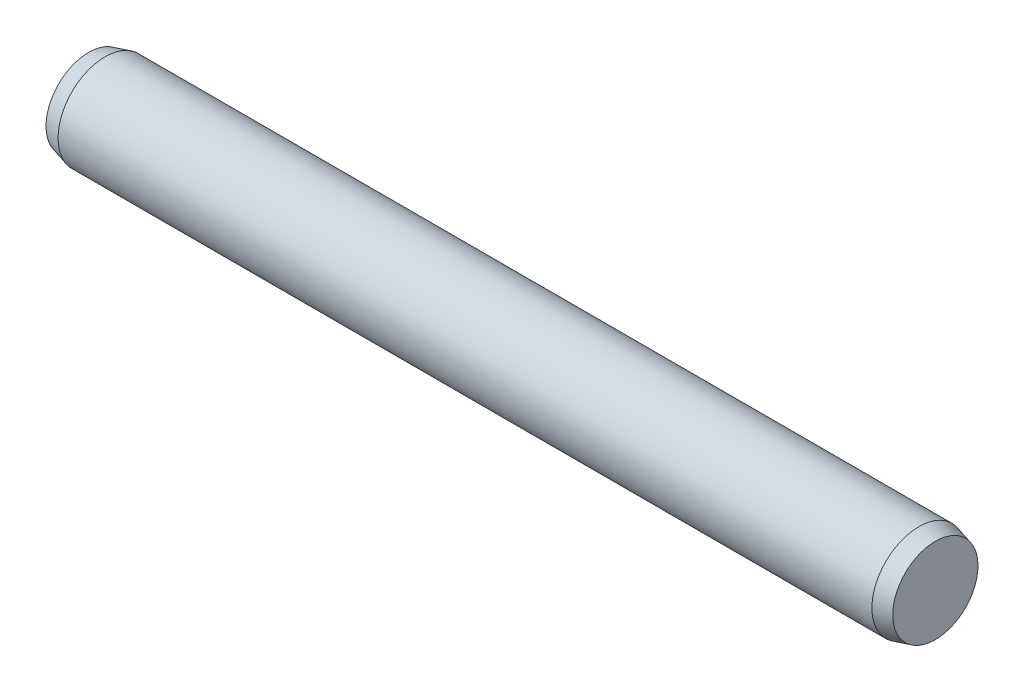
ISO-10303-21;
HEADER;
FILE_DESCRIPTION(('STEP AP214'),'2;1');
FILE_NAME('part.step','',(''),(''),'','','');
FILE_SCHEMA(('AUTOMOTIVE_DESIGN { 1 0 10303 214 1 1 1 1 }'));
ENDSEC;
DATA;
#1=APPLICATION_CONTEXT('core data for automotive mechanical design processes');
#2=APPLICATION_PROTOCOL_DEFINITION('international standard','automotive_design',2000,#1);
#3=PRODUCT_CONTEXT('',#1,'mechanical');
#4=PRODUCT('Part','Part','',(#3));
#5=PRODUCT_RELATED_PRODUCT_CATEGORY('part','',(#4));
#6=PRODUCT_DEFINITION_FORMATION('','',#4);
#7=PRODUCT_DEFINITION_CONTEXT('part definition',#1,'design');
#8=PRODUCT_DEFINITION('design','',#6,#7);
#9=PRODUCT_DEFINITION_SHAPE('','',#8);
#10=(LENGTH_UNIT() NAMED_UNIT(*) SI_UNIT(.MILLI.,.METRE.));
#11=(NAMED_UNIT(*) PLANE_ANGLE_UNIT() SI_UNIT($,.RADIAN.));
#12=(NAMED_UNIT(*) SI_UNIT($,.STERADIAN.) SOLID_ANGLE_UNIT());
#13=UNCERTAINTY_MEASURE_WITH_UNIT(LENGTH_MEASURE(1.E-05),#10,'distance_accuracy_value','');
#14=(GEOMETRIC_REPRESENTATION_CONTEXT(3) GLOBAL_UNCERTAINTY_ASSIGNED_CONTEXT((#13)) GLOBAL_UNIT_ASSIGNED_CONTEXT((#10,
#11,#12)) REPRESENTATION_CONTEXT('',''));
#15=CARTESIAN_POINT('',(0.,0.,0.));
#16=DIRECTION('',(0.,0.,1.));
#17=DIRECTION('',(1.,0.,0.));
#18=AXIS2_PLACEMENT_3D('',#15,#16,#17);
#19=CARTESIAN_POINT('',(-8.65,0.,0.));
#20=DIRECTION('',(1.,0.,0.));
#21=DIRECTION('',(0.,0.,-1.));
#22=AXIS2_PLACEMENT_3D('',#19,#20,#21);
#23=CYLINDRICAL_SURFACE('',#22,1.);
#24=CARTESIAN_POINT('',(-8.65,0.,0.));
#25=DIRECTION('',(-1.,0.,0.));
#26=DIRECTION('',(0.,0.,1.));
#27=AXIS2_PLACEMENT_3D('',#24,#25,#26);
#28=CIRCLE('',#27,1.);
#29=CARTESIAN_POINT('',(-8.65,0.,1.));
#30=VERTEX_POINT('',#29);
#31=EDGE_CURVE('E44',#30,#30,#28,.T.);
#32=ORIENTED_EDGE('',*,*,#31,.F.);
#33=EDGE_LOOP('',(#32));
#34=FACE_BOUND('',#33,.T.);
#35=CARTESIAN_POINT('',(8.65,0.,0.));
#36=DIRECTION('',(1.,0.,0.));
#37=DIRECTION('',(0.,0.,-1.));
#38=AXIS2_PLACEMENT_3D('',#35,#36,#37);
#39=CIRCLE('',#38,1.);
#40=CARTESIAN_POINT('',(8.65,0.,-1.));
#41=VERTEX_POINT('',#40);
#42=EDGE_CURVE('E10',#41,#41,#39,.T.);
#43=ORIENTED_EDGE('',*,*,#42,.F.);
#44=EDGE_LOOP('',(#43));
#45=FACE_BOUND('',#44,.T.);
#46=ADVANCED_FACE('F30',(#34,#45),#23,.T.);
#47=CARTESIAN_POINT('',(8.65,0.,0.));
#48=DIRECTION('',(-1.,0.,0.));
#49=DIRECTION('',(0.,0.,-1.));
#50=AXIS2_PLACEMENT_3D('',#47,#48,#49);
#51=CONICAL_SURFACE('',#50,1.,0.26179938779915);
#52=CARTESIAN_POINT('',(9.,0.,0.));
#53=DIRECTION('',(1.,0.,0.));
#54=DIRECTION('',(0.,0.,-1.));
#55=AXIS2_PLACEMENT_3D('',#52,#53,#54);
#56=CIRCLE('',#55,0.906217782649108);
#57=CARTESIAN_POINT('',(9.,0.,-0.906217782649108));
#58=VERTEX_POINT('',#57);
#59=EDGE_CURVE('E36',#58,#58,#56,.T.);
#60=ORIENTED_EDGE('',*,*,#59,.F.);
#61=EDGE_LOOP('',(#60));
#62=FACE_BOUND('',#61,.T.);
#63=ORIENTED_EDGE('',*,*,#42,.T.);
#64=EDGE_LOOP('',(#63));
#65=FACE_BOUND('',#64,.T.);
#66=ADVANCED_FACE('F54',(#62,#65),#51,.T.);
#67=CARTESIAN_POINT('',(9.,0.,0.));
#68=DIRECTION('',(1.,0.,0.));
#69=DIRECTION('',(0.,0.,-1.));
#70=AXIS2_PLACEMENT_3D('',#67,#68,#69);
#71=PLANE('',#70);
#72=ORIENTED_EDGE('',*,*,#59,.T.);
#73=EDGE_LOOP('',(#72));
#74=FACE_BOUND('',#73,.T.);
#75=ADVANCED_FACE('F58',(#74),#71,.T.);
#76=CARTESIAN_POINT('',(-8.65,0.,0.));
#77=DIRECTION('',(1.,0.,0.));
#78=DIRECTION('',(0.,0.,1.));
#79=AXIS2_PLACEMENT_3D('',#76,#77,#78);
#80=CONICAL_SURFACE('',#79,1.,0.26179938779915);
#81=CARTESIAN_POINT('',(-9.,0.,0.));
#82=DIRECTION('',(-1.,0.,0.));
#83=DIRECTION('',(0.,0.,1.));
#84=AXIS2_PLACEMENT_3D('',#81,#82,#83);
#85=CIRCLE('',#84,0.906217782649108);
#86=CARTESIAN_POINT('',(-9.,0.,0.906217782649108));
#87=VERTEX_POINT('',#86);
#88=EDGE_CURVE('E40',#87,#87,#85,.T.);
#89=ORIENTED_EDGE('',*,*,#88,.F.);
#90=EDGE_LOOP('',(#89));
#91=FACE_BOUND('',#90,.T.);
#92=ORIENTED_EDGE('',*,*,#31,.T.);
#93=EDGE_LOOP('',(#92));
#94=FACE_BOUND('',#93,.T.);
#95=ADVANCED_FACE('F50',(#91,#94),#80,.T.);
#96=CARTESIAN_POINT('',(-9.,0.,0.));
#97=DIRECTION('',(-1.,0.,0.));
#98=DIRECTION('',(0.,0.,1.));
#99=AXIS2_PLACEMENT_3D('',#96,#97,#98);
#100=PLANE('',#99);
#101=ORIENTED_EDGE('',*,*,#88,.T.);
#102=EDGE_LOOP('',(#101));
#103=FACE_BOUND('',#102,.T.);
#104=ADVANCED_FACE('F67',(#103),#100,.T.);
#105=CLOSED_SHELL('',(#46,#66,#75,#95,#104));
#106=MANIFOLD_SOLID_BREP('B2',#105);
#107=ADVANCED_BREP_SHAPE_REPRESENTATION('',(#18,#106),#14);
#108=SHAPE_DEFINITION_REPRESENTATION(#9,#107);
ENDSEC;
END-ISO-10303-21;
